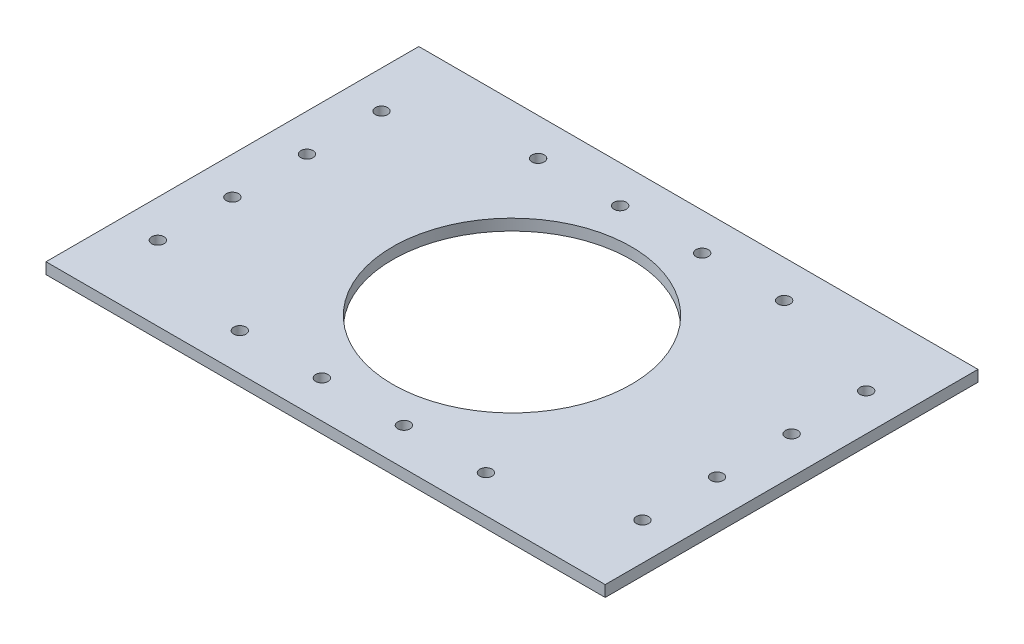
ISO-10303-21;
HEADER;
FILE_DESCRIPTION(('STEP AP214'),'2;1');
FILE_NAME('part.step','',(''),(''),'','','');
FILE_SCHEMA(('AUTOMOTIVE_DESIGN { 1 0 10303 214 1 1 1 1 }'));
ENDSEC;
DATA;
#1=APPLICATION_CONTEXT('core data for automotive mechanical design processes');
#2=APPLICATION_PROTOCOL_DEFINITION('international standard','automotive_design',2000,#1);
#3=PRODUCT_CONTEXT('',#1,'mechanical');
#4=PRODUCT('Part','Part','',(#3));
#5=PRODUCT_RELATED_PRODUCT_CATEGORY('part','',(#4));
#6=PRODUCT_DEFINITION_FORMATION('','',#4);
#7=PRODUCT_DEFINITION_CONTEXT('part definition',#1,'design');
#8=PRODUCT_DEFINITION('design','',#6,#7);
#9=PRODUCT_DEFINITION_SHAPE('','',#8);
#10=(LENGTH_UNIT() NAMED_UNIT(*) SI_UNIT(.MILLI.,.METRE.));
#11=(NAMED_UNIT(*) PLANE_ANGLE_UNIT() SI_UNIT($,.RADIAN.));
#12=(NAMED_UNIT(*) SI_UNIT($,.STERADIAN.) SOLID_ANGLE_UNIT());
#13=UNCERTAINTY_MEASURE_WITH_UNIT(LENGTH_MEASURE(1.E-05),#10,'distance_accuracy_value','');
#14=(GEOMETRIC_REPRESENTATION_CONTEXT(3) GLOBAL_UNCERTAINTY_ASSIGNED_CONTEXT((#13)) GLOBAL_UNIT_ASSIGNED_CONTEXT((#10,
#11,#12)) REPRESENTATION_CONTEXT('',''));
#15=CARTESIAN_POINT('',(0.,0.,0.));
#16=DIRECTION('',(0.,0.,1.));
#17=DIRECTION('',(1.,0.,0.));
#18=AXIS2_PLACEMENT_3D('',#15,#16,#17);
#19=CARTESIAN_POINT('',(0.,3.,0.));
#20=DIRECTION('',(0.,1.,0.));
#21=DIRECTION('',(0.,0.,1.));
#22=AXIS2_PLACEMENT_3D('',#19,#20,#21);
#23=PLANE('',#22);
#24=CARTESIAN_POINT('',(-11.,3.,40.));
#25=DIRECTION('',(0.,1.,0.));
#26=DIRECTION('',(0.,0.,-1.));
#27=AXIS2_PLACEMENT_3D('',#24,#25,#26);
#28=CIRCLE('',#27,1.65);
#29=CARTESIAN_POINT('',(-11.,3.,38.35));
#30=VERTEX_POINT('',#29);
#31=EDGE_CURVE('E207',#30,#30,#28,.T.);
#32=ORIENTED_EDGE('',*,*,#31,.F.);
#33=EDGE_LOOP('',(#32));
#34=FACE_BOUND('',#33,.T.);
#35=CARTESIAN_POINT('',(33.,3.,40.));
#36=DIRECTION('',(0.,1.,0.));
#37=DIRECTION('',(0.,0.,-1.));
#38=AXIS2_PLACEMENT_3D('',#35,#36,#37);
#39=CIRCLE('',#38,1.65);
#40=CARTESIAN_POINT('',(33.,3.,38.35));
#41=VERTEX_POINT('',#40);
#42=EDGE_CURVE('E195',#41,#41,#39,.T.);
#43=ORIENTED_EDGE('',*,*,#42,.F.);
#44=EDGE_LOOP('',(#43));
#45=FACE_BOUND('',#44,.T.);
#46=CARTESIAN_POINT('',(-11.,3.,-40.));
#47=DIRECTION('',(0.,1.,0.));
#48=DIRECTION('',(0.,0.,1.));
#49=AXIS2_PLACEMENT_3D('',#46,#47,#48);
#50=CIRCLE('',#49,1.65);
#51=CARTESIAN_POINT('',(-11.,3.,-38.35));
#52=VERTEX_POINT('',#51);
#53=EDGE_CURVE('E183',#52,#52,#50,.T.);
#54=ORIENTED_EDGE('',*,*,#53,.F.);
#55=EDGE_LOOP('',(#54));
#56=FACE_BOUND('',#55,.T.);
#57=CARTESIAN_POINT('',(33.,3.,-40.));
#58=DIRECTION('',(0.,1.,0.));
#59=DIRECTION('',(0.,0.,1.));
#60=AXIS2_PLACEMENT_3D('',#57,#58,#59);
#61=CIRCLE('',#60,1.65);
#62=CARTESIAN_POINT('',(33.,3.,-38.35));
#63=VERTEX_POINT('',#62);
#64=EDGE_CURVE('E171',#63,#63,#61,.T.);
#65=ORIENTED_EDGE('',*,*,#64,.F.);
#66=EDGE_LOOP('',(#65));
#67=FACE_BOUND('',#66,.T.);
#68=CARTESIAN_POINT('',(64.9999999999999,3.,-10.));
#69=DIRECTION('',(0.,1.,0.));
#70=DIRECTION('',(0.,0.,-1.));
#71=AXIS2_PLACEMENT_3D('',#68,#69,#70);
#72=CIRCLE('',#71,1.65);
#73=CARTESIAN_POINT('',(64.9999999999999,3.,-11.65));
#74=VERTEX_POINT('',#73);
#75=EDGE_CURVE('E159',#74,#74,#72,.T.);
#76=ORIENTED_EDGE('',*,*,#75,.F.);
#77=EDGE_LOOP('',(#76));
#78=FACE_BOUND('',#77,.T.);
#79=CARTESIAN_POINT('',(64.9999999999999,3.,30.));
#80=DIRECTION('',(0.,1.,0.));
#81=DIRECTION('',(0.,0.,-1.));
#82=AXIS2_PLACEMENT_3D('',#79,#80,#81);
#83=CIRCLE('',#82,1.65);
#84=CARTESIAN_POINT('',(64.9999999999999,3.,28.35));
#85=VERTEX_POINT('',#84);
#86=EDGE_CURVE('E147',#85,#85,#83,.T.);
#87=ORIENTED_EDGE('',*,*,#86,.F.);
#88=EDGE_LOOP('',(#87));
#89=FACE_BOUND('',#88,.T.);
#90=CARTESIAN_POINT('',(-65.,3.,9.99999999999999));
#91=DIRECTION('',(0.,1.,0.));
#92=DIRECTION('',(0.,0.,1.));
#93=AXIS2_PLACEMENT_3D('',#90,#91,#92);
#94=CIRCLE('',#93,1.65);
#95=CARTESIAN_POINT('',(-65.,3.,11.65));
#96=VERTEX_POINT('',#95);
#97=EDGE_CURVE('E135',#96,#96,#94,.T.);
#98=ORIENTED_EDGE('',*,*,#97,.F.);
#99=EDGE_LOOP('',(#98));
#100=FACE_BOUND('',#99,.T.);
#101=CARTESIAN_POINT('',(-65.,3.,-30.));
#102=DIRECTION('',(0.,1.,0.));
#103=DIRECTION('',(0.,0.,1.));
#104=AXIS2_PLACEMENT_3D('',#101,#102,#103);
#105=CIRCLE('',#104,1.65);
#106=CARTESIAN_POINT('',(-65.,3.,-28.35));
#107=VERTEX_POINT('',#106);
#108=EDGE_CURVE('E123',#107,#107,#105,.T.);
#109=ORIENTED_EDGE('',*,*,#108,.F.);
#110=EDGE_LOOP('',(#109));
#111=FACE_BOUND('',#110,.T.);
#112=DIRECTION('',(0.,0.,-1.));
#113=VECTOR('',#112,1.);
#114=CARTESIAN_POINT('',(75.,3.,-50.));
#115=LINE('',#114,#113);
#116=CARTESIAN_POINT('',(75.,3.,50.));
#117=VERTEX_POINT('',#116);
#118=CARTESIAN_POINT('',(75.,3.,-50.));
#119=VERTEX_POINT('',#118);
#120=EDGE_CURVE('E93',#117,#119,#115,.T.);
#121=ORIENTED_EDGE('',*,*,#120,.T.);
#122=DIRECTION('',(-1.,0.,0.));
#123=VECTOR('',#122,1.);
#124=CARTESIAN_POINT('',(-75.,3.,-50.));
#125=LINE('',#124,#123);
#126=CARTESIAN_POINT('',(-75.,3.,-50.));
#127=VERTEX_POINT('',#126);
#128=EDGE_CURVE('E88',#119,#127,#125,.T.);
#129=ORIENTED_EDGE('',*,*,#128,.T.);
#130=DIRECTION('',(0.,0.,1.));
#131=VECTOR('',#130,1.);
#132=CARTESIAN_POINT('',(-75.,3.,-50.));
#133=LINE('',#132,#131);
#134=CARTESIAN_POINT('',(-75.,3.,50.));
#135=VERTEX_POINT('',#134);
#136=EDGE_CURVE('E91',#127,#135,#133,.T.);
#137=ORIENTED_EDGE('',*,*,#136,.T.);
#138=DIRECTION('',(1.,0.,0.));
#139=VECTOR('',#138,1.);
#140=CARTESIAN_POINT('',(-75.,3.,50.));
#141=LINE('',#140,#139);
#142=EDGE_CURVE('E58',#135,#117,#141,.T.);
#143=ORIENTED_EDGE('',*,*,#142,.T.);
#144=EDGE_LOOP('',(#121,#129,#137,#143));
#145=FACE_BOUND('',#144,.T.);
#146=CARTESIAN_POINT('',(0.,3.,0.));
#147=DIRECTION('',(0.,1.,0.));
#148=DIRECTION('',(0.,0.,1.));
#149=AXIS2_PLACEMENT_3D('',#146,#147,#148);
#150=CIRCLE('',#149,32.);
#151=CARTESIAN_POINT('',(0.,3.,32.));
#152=VERTEX_POINT('',#151);
#153=EDGE_CURVE('E108',#152,#152,#150,.T.);
#154=ORIENTED_EDGE('',*,*,#153,.F.);
#155=EDGE_LOOP('',(#154));
#156=FACE_BOUND('',#155,.T.);
#157=CARTESIAN_POINT('',(-65.,3.,-10.));
#158=DIRECTION('',(0.,1.,0.));
#159=DIRECTION('',(0.,0.,1.));
#160=AXIS2_PLACEMENT_3D('',#157,#158,#159);
#161=CIRCLE('',#160,1.65);
#162=CARTESIAN_POINT('',(-65.,3.,-8.35000000000001));
#163=VERTEX_POINT('',#162);
#164=EDGE_CURVE('E129',#163,#163,#161,.T.);
#165=ORIENTED_EDGE('',*,*,#164,.F.);
#166=EDGE_LOOP('',(#165));
#167=FACE_BOUND('',#166,.T.);
#168=CARTESIAN_POINT('',(-65.,3.,30.));
#169=DIRECTION('',(0.,1.,0.));
#170=DIRECTION('',(0.,0.,1.));
#171=AXIS2_PLACEMENT_3D('',#168,#169,#170);
#172=CIRCLE('',#171,1.65);
#173=CARTESIAN_POINT('',(-65.,3.,31.65));
#174=VERTEX_POINT('',#173);
#175=EDGE_CURVE('E141',#174,#174,#172,.T.);
#176=ORIENTED_EDGE('',*,*,#175,.F.);
#177=EDGE_LOOP('',(#176));
#178=FACE_BOUND('',#177,.T.);
#179=CARTESIAN_POINT('',(64.9999999999999,3.,9.99999999999998));
#180=DIRECTION('',(0.,1.,0.));
#181=DIRECTION('',(0.,0.,-1.));
#182=AXIS2_PLACEMENT_3D('',#179,#180,#181);
#183=CIRCLE('',#182,1.65);
#184=CARTESIAN_POINT('',(64.9999999999999,3.,8.34999999999998));
#185=VERTEX_POINT('',#184);
#186=EDGE_CURVE('E153',#185,#185,#183,.T.);
#187=ORIENTED_EDGE('',*,*,#186,.F.);
#188=EDGE_LOOP('',(#187));
#189=FACE_BOUND('',#188,.T.);
#190=CARTESIAN_POINT('',(64.9999999999999,3.,-30.));
#191=DIRECTION('',(0.,1.,0.));
#192=DIRECTION('',(0.,0.,-1.));
#193=AXIS2_PLACEMENT_3D('',#190,#191,#192);
#194=CIRCLE('',#193,1.65);
#195=CARTESIAN_POINT('',(64.9999999999999,3.,-31.65));
#196=VERTEX_POINT('',#195);
#197=EDGE_CURVE('E165',#196,#196,#194,.T.);
#198=ORIENTED_EDGE('',*,*,#197,.F.);
#199=EDGE_LOOP('',(#198));
#200=FACE_BOUND('',#199,.T.);
#201=CARTESIAN_POINT('',(11.,3.,-40.));
#202=DIRECTION('',(0.,1.,0.));
#203=DIRECTION('',(0.,0.,1.));
#204=AXIS2_PLACEMENT_3D('',#201,#202,#203);
#205=CIRCLE('',#204,1.65);
#206=CARTESIAN_POINT('',(11.,3.,-38.35));
#207=VERTEX_POINT('',#206);
#208=EDGE_CURVE('E177',#207,#207,#205,.T.);
#209=ORIENTED_EDGE('',*,*,#208,.F.);
#210=EDGE_LOOP('',(#209));
#211=FACE_BOUND('',#210,.T.);
#212=CARTESIAN_POINT('',(-33.,3.,-40.));
#213=DIRECTION('',(0.,1.,0.));
#214=DIRECTION('',(0.,0.,1.));
#215=AXIS2_PLACEMENT_3D('',#212,#213,#214);
#216=CIRCLE('',#215,1.65);
#217=CARTESIAN_POINT('',(-33.,3.,-38.35));
#218=VERTEX_POINT('',#217);
#219=EDGE_CURVE('E189',#218,#218,#216,.T.);
#220=ORIENTED_EDGE('',*,*,#219,.F.);
#221=EDGE_LOOP('',(#220));
#222=FACE_BOUND('',#221,.T.);
#223=CARTESIAN_POINT('',(11.,3.,40.));
#224=DIRECTION('',(0.,1.,0.));
#225=DIRECTION('',(0.,0.,-1.));
#226=AXIS2_PLACEMENT_3D('',#223,#224,#225);
#227=CIRCLE('',#226,1.65);
#228=CARTESIAN_POINT('',(11.,3.,38.35));
#229=VERTEX_POINT('',#228);
#230=EDGE_CURVE('E201',#229,#229,#227,.T.);
#231=ORIENTED_EDGE('',*,*,#230,.F.);
#232=EDGE_LOOP('',(#231));
#233=FACE_BOUND('',#232,.T.);
#234=CARTESIAN_POINT('',(-33.,3.,40.));
#235=DIRECTION('',(0.,1.,0.));
#236=DIRECTION('',(0.,0.,-1.));
#237=AXIS2_PLACEMENT_3D('',#234,#235,#236);
#238=CIRCLE('',#237,1.65);
#239=CARTESIAN_POINT('',(-33.,3.,38.35));
#240=VERTEX_POINT('',#239);
#241=EDGE_CURVE('E213',#240,#240,#238,.T.);
#242=ORIENTED_EDGE('',*,*,#241,.F.);
#243=EDGE_LOOP('',(#242));
#244=FACE_BOUND('',#243,.T.);
#245=ADVANCED_FACE('F41',(#34,#45,#56,#67,#78,#89,#100,#111,#145,#156,#167,#178,#189,#200,#211,
#222,#233,#244),#23,.T.);
#246=CARTESIAN_POINT('',(0.,0.,0.));
#247=DIRECTION('',(0.,1.,0.));
#248=DIRECTION('',(0.,0.,1.));
#249=AXIS2_PLACEMENT_3D('',#246,#247,#248);
#250=PLANE('',#249);
#251=DIRECTION('',(0.,0.,-1.));
#252=VECTOR('',#251,1.);
#253=CARTESIAN_POINT('',(75.,0.,-50.));
#254=LINE('',#253,#252);
#255=CARTESIAN_POINT('',(75.,0.,50.));
#256=VERTEX_POINT('',#255);
#257=CARTESIAN_POINT('',(75.,0.,-50.));
#258=VERTEX_POINT('',#257);
#259=EDGE_CURVE('E105',#256,#258,#254,.T.);
#260=ORIENTED_EDGE('',*,*,#259,.F.);
#261=DIRECTION('',(1.,0.,0.));
#262=VECTOR('',#261,1.);
#263=CARTESIAN_POINT('',(-75.,0.,50.));
#264=LINE('',#263,#262);
#265=CARTESIAN_POINT('',(-75.,0.,50.));
#266=VERTEX_POINT('',#265);
#267=EDGE_CURVE('E81',#266,#256,#264,.T.);
#268=ORIENTED_EDGE('',*,*,#267,.F.);
#269=DIRECTION('',(0.,0.,1.));
#270=VECTOR('',#269,1.);
#271=CARTESIAN_POINT('',(-75.,0.,-50.));
#272=LINE('',#271,#270);
#273=CARTESIAN_POINT('',(-75.,0.,-50.));
#274=VERTEX_POINT('',#273);
#275=EDGE_CURVE('E75',#274,#266,#272,.T.);
#276=ORIENTED_EDGE('',*,*,#275,.F.);
#277=DIRECTION('',(-1.,0.,0.));
#278=VECTOR('',#277,1.);
#279=CARTESIAN_POINT('',(-75.,0.,-50.));
#280=LINE('',#279,#278);
#281=EDGE_CURVE('E97',#258,#274,#280,.T.);
#282=ORIENTED_EDGE('',*,*,#281,.F.);
#283=EDGE_LOOP('',(#260,#268,#276,#282));
#284=FACE_BOUND('',#283,.T.);
#285=CARTESIAN_POINT('',(0.,0.,0.));
#286=DIRECTION('',(0.,1.,0.));
#287=DIRECTION('',(0.,0.,1.));
#288=AXIS2_PLACEMENT_3D('',#285,#286,#287);
#289=CIRCLE('',#288,32.);
#290=CARTESIAN_POINT('',(0.,0.,32.));
#291=VERTEX_POINT('',#290);
#292=EDGE_CURVE('E120',#291,#291,#289,.T.);
#293=ORIENTED_EDGE('',*,*,#292,.T.);
#294=EDGE_LOOP('',(#293));
#295=FACE_BOUND('',#294,.T.);
#296=CARTESIAN_POINT('',(-65.,0.,-30.));
#297=DIRECTION('',(0.,1.,0.));
#298=DIRECTION('',(0.,0.,1.));
#299=AXIS2_PLACEMENT_3D('',#296,#297,#298);
#300=CIRCLE('',#299,1.65);
#301=CARTESIAN_POINT('',(-65.,0.,-28.35));
#302=VERTEX_POINT('',#301);
#303=EDGE_CURVE('E126',#302,#302,#300,.T.);
#304=ORIENTED_EDGE('',*,*,#303,.T.);
#305=EDGE_LOOP('',(#304));
#306=FACE_BOUND('',#305,.T.);
#307=CARTESIAN_POINT('',(-65.,0.,-10.));
#308=DIRECTION('',(0.,1.,0.));
#309=DIRECTION('',(0.,0.,1.));
#310=AXIS2_PLACEMENT_3D('',#307,#308,#309);
#311=CIRCLE('',#310,1.65);
#312=CARTESIAN_POINT('',(-65.,0.,-8.35000000000001));
#313=VERTEX_POINT('',#312);
#314=EDGE_CURVE('E132',#313,#313,#311,.T.);
#315=ORIENTED_EDGE('',*,*,#314,.T.);
#316=EDGE_LOOP('',(#315));
#317=FACE_BOUND('',#316,.T.);
#318=CARTESIAN_POINT('',(-65.,0.,9.99999999999999));
#319=DIRECTION('',(0.,1.,0.));
#320=DIRECTION('',(0.,0.,1.));
#321=AXIS2_PLACEMENT_3D('',#318,#319,#320);
#322=CIRCLE('',#321,1.65);
#323=CARTESIAN_POINT('',(-65.,0.,11.65));
#324=VERTEX_POINT('',#323);
#325=EDGE_CURVE('E138',#324,#324,#322,.T.);
#326=ORIENTED_EDGE('',*,*,#325,.T.);
#327=EDGE_LOOP('',(#326));
#328=FACE_BOUND('',#327,.T.);
#329=CARTESIAN_POINT('',(-65.,0.,30.));
#330=DIRECTION('',(0.,1.,0.));
#331=DIRECTION('',(0.,0.,1.));
#332=AXIS2_PLACEMENT_3D('',#329,#330,#331);
#333=CIRCLE('',#332,1.65);
#334=CARTESIAN_POINT('',(-65.,0.,31.65));
#335=VERTEX_POINT('',#334);
#336=EDGE_CURVE('E144',#335,#335,#333,.T.);
#337=ORIENTED_EDGE('',*,*,#336,.T.);
#338=EDGE_LOOP('',(#337));
#339=FACE_BOUND('',#338,.T.);
#340=CARTESIAN_POINT('',(64.9999999999999,0.,30.));
#341=DIRECTION('',(0.,1.,0.));
#342=DIRECTION('',(0.,0.,-1.));
#343=AXIS2_PLACEMENT_3D('',#340,#341,#342);
#344=CIRCLE('',#343,1.65);
#345=CARTESIAN_POINT('',(64.9999999999999,0.,28.35));
#346=VERTEX_POINT('',#345);
#347=EDGE_CURVE('E150',#346,#346,#344,.T.);
#348=ORIENTED_EDGE('',*,*,#347,.T.);
#349=EDGE_LOOP('',(#348));
#350=FACE_BOUND('',#349,.T.);
#351=CARTESIAN_POINT('',(64.9999999999999,0.,9.99999999999998));
#352=DIRECTION('',(0.,1.,0.));
#353=DIRECTION('',(0.,0.,-1.));
#354=AXIS2_PLACEMENT_3D('',#351,#352,#353);
#355=CIRCLE('',#354,1.65);
#356=CARTESIAN_POINT('',(64.9999999999999,0.,8.34999999999998));
#357=VERTEX_POINT('',#356);
#358=EDGE_CURVE('E156',#357,#357,#355,.T.);
#359=ORIENTED_EDGE('',*,*,#358,.T.);
#360=EDGE_LOOP('',(#359));
#361=FACE_BOUND('',#360,.T.);
#362=CARTESIAN_POINT('',(64.9999999999999,0.,-10.));
#363=DIRECTION('',(0.,1.,0.));
#364=DIRECTION('',(0.,0.,-1.));
#365=AXIS2_PLACEMENT_3D('',#362,#363,#364);
#366=CIRCLE('',#365,1.65);
#367=CARTESIAN_POINT('',(64.9999999999999,0.,-11.65));
#368=VERTEX_POINT('',#367);
#369=EDGE_CURVE('E162',#368,#368,#366,.T.);
#370=ORIENTED_EDGE('',*,*,#369,.T.);
#371=EDGE_LOOP('',(#370));
#372=FACE_BOUND('',#371,.T.);
#373=CARTESIAN_POINT('',(64.9999999999999,0.,-30.));
#374=DIRECTION('',(0.,1.,0.));
#375=DIRECTION('',(0.,0.,-1.));
#376=AXIS2_PLACEMENT_3D('',#373,#374,#375);
#377=CIRCLE('',#376,1.65);
#378=CARTESIAN_POINT('',(64.9999999999999,0.,-31.65));
#379=VERTEX_POINT('',#378);
#380=EDGE_CURVE('E168',#379,#379,#377,.T.);
#381=ORIENTED_EDGE('',*,*,#380,.T.);
#382=EDGE_LOOP('',(#381));
#383=FACE_BOUND('',#382,.T.);
#384=CARTESIAN_POINT('',(33.,0.,-40.));
#385=DIRECTION('',(0.,1.,0.));
#386=DIRECTION('',(0.,0.,1.));
#387=AXIS2_PLACEMENT_3D('',#384,#385,#386);
#388=CIRCLE('',#387,1.65);
#389=CARTESIAN_POINT('',(33.,0.,-38.35));
#390=VERTEX_POINT('',#389);
#391=EDGE_CURVE('E174',#390,#390,#388,.T.);
#392=ORIENTED_EDGE('',*,*,#391,.T.);
#393=EDGE_LOOP('',(#392));
#394=FACE_BOUND('',#393,.T.);
#395=CARTESIAN_POINT('',(11.,0.,-40.));
#396=DIRECTION('',(0.,1.,0.));
#397=DIRECTION('',(0.,0.,1.));
#398=AXIS2_PLACEMENT_3D('',#395,#396,#397);
#399=CIRCLE('',#398,1.65);
#400=CARTESIAN_POINT('',(11.,0.,-38.35));
#401=VERTEX_POINT('',#400);
#402=EDGE_CURVE('E180',#401,#401,#399,.T.);
#403=ORIENTED_EDGE('',*,*,#402,.T.);
#404=EDGE_LOOP('',(#403));
#405=FACE_BOUND('',#404,.T.);
#406=CARTESIAN_POINT('',(-11.,0.,-40.));
#407=DIRECTION('',(0.,1.,0.));
#408=DIRECTION('',(0.,0.,1.));
#409=AXIS2_PLACEMENT_3D('',#406,#407,#408);
#410=CIRCLE('',#409,1.65);
#411=CARTESIAN_POINT('',(-11.,0.,-38.35));
#412=VERTEX_POINT('',#411);
#413=EDGE_CURVE('E186',#412,#412,#410,.T.);
#414=ORIENTED_EDGE('',*,*,#413,.T.);
#415=EDGE_LOOP('',(#414));
#416=FACE_BOUND('',#415,.T.);
#417=CARTESIAN_POINT('',(-33.,0.,-40.));
#418=DIRECTION('',(0.,1.,0.));
#419=DIRECTION('',(0.,0.,1.));
#420=AXIS2_PLACEMENT_3D('',#417,#418,#419);
#421=CIRCLE('',#420,1.65);
#422=CARTESIAN_POINT('',(-33.,0.,-38.35));
#423=VERTEX_POINT('',#422);
#424=EDGE_CURVE('E192',#423,#423,#421,.T.);
#425=ORIENTED_EDGE('',*,*,#424,.T.);
#426=EDGE_LOOP('',(#425));
#427=FACE_BOUND('',#426,.T.);
#428=CARTESIAN_POINT('',(33.,0.,40.));
#429=DIRECTION('',(0.,1.,0.));
#430=DIRECTION('',(0.,0.,-1.));
#431=AXIS2_PLACEMENT_3D('',#428,#429,#430);
#432=CIRCLE('',#431,1.65);
#433=CARTESIAN_POINT('',(33.,0.,38.35));
#434=VERTEX_POINT('',#433);
#435=EDGE_CURVE('E198',#434,#434,#432,.T.);
#436=ORIENTED_EDGE('',*,*,#435,.T.);
#437=EDGE_LOOP('',(#436));
#438=FACE_BOUND('',#437,.T.);
#439=CARTESIAN_POINT('',(11.,0.,40.));
#440=DIRECTION('',(0.,1.,0.));
#441=DIRECTION('',(0.,0.,-1.));
#442=AXIS2_PLACEMENT_3D('',#439,#440,#441);
#443=CIRCLE('',#442,1.65);
#444=CARTESIAN_POINT('',(11.,0.,38.35));
#445=VERTEX_POINT('',#444);
#446=EDGE_CURVE('E204',#445,#445,#443,.T.);
#447=ORIENTED_EDGE('',*,*,#446,.T.);
#448=EDGE_LOOP('',(#447));
#449=FACE_BOUND('',#448,.T.);
#450=CARTESIAN_POINT('',(-11.,0.,40.));
#451=DIRECTION('',(0.,1.,0.));
#452=DIRECTION('',(0.,0.,-1.));
#453=AXIS2_PLACEMENT_3D('',#450,#451,#452);
#454=CIRCLE('',#453,1.65);
#455=CARTESIAN_POINT('',(-11.,0.,38.35));
#456=VERTEX_POINT('',#455);
#457=EDGE_CURVE('E210',#456,#456,#454,.T.);
#458=ORIENTED_EDGE('',*,*,#457,.T.);
#459=EDGE_LOOP('',(#458));
#460=FACE_BOUND('',#459,.T.);
#461=CARTESIAN_POINT('',(-33.,0.,40.));
#462=DIRECTION('',(0.,1.,0.));
#463=DIRECTION('',(0.,0.,-1.));
#464=AXIS2_PLACEMENT_3D('',#461,#462,#463);
#465=CIRCLE('',#464,1.65);
#466=CARTESIAN_POINT('',(-33.,0.,38.35));
#467=VERTEX_POINT('',#466);
#468=EDGE_CURVE('E216',#467,#467,#465,.T.);
#469=ORIENTED_EDGE('',*,*,#468,.T.);
#470=EDGE_LOOP('',(#469));
#471=FACE_BOUND('',#470,.T.);
#472=ADVANCED_FACE('F116',(#284,#295,#306,#317,#328,#339,#350,#361,#372,#383,#394,#405,#416,
#427,#438,#449,#460,#471),#250,.F.);
#473=CARTESIAN_POINT('',(75.,3.,-50.));
#474=DIRECTION('',(-1.,0.,0.));
#475=DIRECTION('',(0.,0.,1.));
#476=AXIS2_PLACEMENT_3D('',#473,#474,#475);
#477=PLANE('',#476);
#478=ORIENTED_EDGE('',*,*,#259,.T.);
#479=DIRECTION('',(0.,-1.,0.));
#480=VECTOR('',#479,1.);
#481=CARTESIAN_POINT('',(75.,3.,-50.));
#482=LINE('',#481,#480);
#483=EDGE_CURVE('E11',#119,#258,#482,.T.);
#484=ORIENTED_EDGE('',*,*,#483,.F.);
#485=ORIENTED_EDGE('',*,*,#120,.F.);
#486=DIRECTION('',(0.,-1.,0.));
#487=VECTOR('',#486,1.);
#488=CARTESIAN_POINT('',(75.,3.,50.));
#489=LINE('',#488,#487);
#490=EDGE_CURVE('E101',#117,#256,#489,.T.);
#491=ORIENTED_EDGE('',*,*,#490,.T.);
#492=EDGE_LOOP('',(#478,#484,#485,#491));
#493=FACE_BOUND('',#492,.T.);
#494=ADVANCED_FACE('F43',(#493),#477,.F.);
#495=CARTESIAN_POINT('',(-75.,3.,-50.));
#496=DIRECTION('',(0.,0.,1.));
#497=DIRECTION('',(1.,0.,0.));
#498=AXIS2_PLACEMENT_3D('',#495,#496,#497);
#499=PLANE('',#498);
#500=ORIENTED_EDGE('',*,*,#281,.T.);
#501=DIRECTION('',(0.,-1.,0.));
#502=VECTOR('',#501,1.);
#503=CARTESIAN_POINT('',(-75.,3.,-50.));
#504=LINE('',#503,#502);
#505=EDGE_CURVE('E50',#127,#274,#504,.T.);
#506=ORIENTED_EDGE('',*,*,#505,.F.);
#507=ORIENTED_EDGE('',*,*,#128,.F.);
#508=ORIENTED_EDGE('',*,*,#483,.T.);
#509=EDGE_LOOP('',(#500,#506,#507,#508));
#510=FACE_BOUND('',#509,.T.);
#511=ADVANCED_FACE('F96',(#510),#499,.F.);
#512=CARTESIAN_POINT('',(-75.,3.,-50.));
#513=DIRECTION('',(1.,0.,0.));
#514=DIRECTION('',(0.,0.,-1.));
#515=AXIS2_PLACEMENT_3D('',#512,#513,#514);
#516=PLANE('',#515);
#517=ORIENTED_EDGE('',*,*,#275,.T.);
#518=DIRECTION('',(0.,-1.,0.));
#519=VECTOR('',#518,1.);
#520=CARTESIAN_POINT('',(-75.,3.,50.));
#521=LINE('',#520,#519);
#522=EDGE_CURVE('E98',#135,#266,#521,.T.);
#523=ORIENTED_EDGE('',*,*,#522,.F.);
#524=ORIENTED_EDGE('',*,*,#136,.F.);
#525=ORIENTED_EDGE('',*,*,#505,.T.);
#526=EDGE_LOOP('',(#517,#523,#524,#525));
#527=FACE_BOUND('',#526,.T.);
#528=ADVANCED_FACE('F99',(#527),#516,.F.);
#529=CARTESIAN_POINT('',(-75.,3.,50.));
#530=DIRECTION('',(0.,0.,-1.));
#531=DIRECTION('',(-1.,0.,0.));
#532=AXIS2_PLACEMENT_3D('',#529,#530,#531);
#533=PLANE('',#532);
#534=ORIENTED_EDGE('',*,*,#267,.T.);
#535=ORIENTED_EDGE('',*,*,#490,.F.);
#536=ORIENTED_EDGE('',*,*,#142,.F.);
#537=ORIENTED_EDGE('',*,*,#522,.T.);
#538=EDGE_LOOP('',(#534,#535,#536,#537));
#539=FACE_BOUND('',#538,.T.);
#540=ADVANCED_FACE('F113',(#539),#533,.F.);
#541=CARTESIAN_POINT('',(0.,3.,0.));
#542=DIRECTION('',(0.,-1.,0.));
#543=DIRECTION('',(0.,0.,-1.));
#544=AXIS2_PLACEMENT_3D('',#541,#542,#543);
#545=CYLINDRICAL_SURFACE('',#544,32.);
#546=ORIENTED_EDGE('',*,*,#153,.T.);
#547=EDGE_LOOP('',(#546));
#548=FACE_BOUND('',#547,.T.);
#549=ORIENTED_EDGE('',*,*,#292,.F.);
#550=EDGE_LOOP('',(#549));
#551=FACE_BOUND('',#550,.T.);
#552=ADVANCED_FACE('F235',(#548,#551),#545,.F.);
#553=CARTESIAN_POINT('',(-65.,3.,-30.));
#554=DIRECTION('',(0.,-1.,0.));
#555=DIRECTION('',(0.,0.,-1.));
#556=AXIS2_PLACEMENT_3D('',#553,#554,#555);
#557=CYLINDRICAL_SURFACE('',#556,1.65);
#558=ORIENTED_EDGE('',*,*,#108,.T.);
#559=EDGE_LOOP('',(#558));
#560=FACE_BOUND('',#559,.T.);
#561=ORIENTED_EDGE('',*,*,#303,.F.);
#562=EDGE_LOOP('',(#561));
#563=FACE_BOUND('',#562,.T.);
#564=ADVANCED_FACE('F280',(#560,#563),#557,.F.);
#565=CARTESIAN_POINT('',(-65.,3.,-10.));
#566=DIRECTION('',(0.,-1.,0.));
#567=DIRECTION('',(0.,0.,-1.));
#568=AXIS2_PLACEMENT_3D('',#565,#566,#567);
#569=CYLINDRICAL_SURFACE('',#568,1.65);
#570=ORIENTED_EDGE('',*,*,#164,.T.);
#571=EDGE_LOOP('',(#570));
#572=FACE_BOUND('',#571,.T.);
#573=ORIENTED_EDGE('',*,*,#314,.F.);
#574=EDGE_LOOP('',(#573));
#575=FACE_BOUND('',#574,.T.);
#576=ADVANCED_FACE('F288',(#572,#575),#569,.F.);
#577=CARTESIAN_POINT('',(-65.,3.,9.99999999999999));
#578=DIRECTION('',(0.,-1.,0.));
#579=DIRECTION('',(0.,0.,-1.));
#580=AXIS2_PLACEMENT_3D('',#577,#578,#579);
#581=CYLINDRICAL_SURFACE('',#580,1.65);
#582=ORIENTED_EDGE('',*,*,#97,.T.);
#583=EDGE_LOOP('',(#582));
#584=FACE_BOUND('',#583,.T.);
#585=ORIENTED_EDGE('',*,*,#325,.F.);
#586=EDGE_LOOP('',(#585));
#587=FACE_BOUND('',#586,.T.);
#588=ADVANCED_FACE('F296',(#584,#587),#581,.F.);
#589=CARTESIAN_POINT('',(-65.,3.,30.));
#590=DIRECTION('',(0.,-1.,0.));
#591=DIRECTION('',(0.,0.,-1.));
#592=AXIS2_PLACEMENT_3D('',#589,#590,#591);
#593=CYLINDRICAL_SURFACE('',#592,1.65);
#594=ORIENTED_EDGE('',*,*,#175,.T.);
#595=EDGE_LOOP('',(#594));
#596=FACE_BOUND('',#595,.T.);
#597=ORIENTED_EDGE('',*,*,#336,.F.);
#598=EDGE_LOOP('',(#597));
#599=FACE_BOUND('',#598,.T.);
#600=ADVANCED_FACE('F305',(#596,#599),#593,.F.);
#601=CARTESIAN_POINT('',(64.9999999999999,3.,30.));
#602=DIRECTION('',(0.,-1.,0.));
#603=DIRECTION('',(0.,0.,-1.));
#604=AXIS2_PLACEMENT_3D('',#601,#602,#603);
#605=CYLINDRICAL_SURFACE('',#604,1.65);
#606=ORIENTED_EDGE('',*,*,#86,.T.);
#607=EDGE_LOOP('',(#606));
#608=FACE_BOUND('',#607,.T.);
#609=ORIENTED_EDGE('',*,*,#347,.F.);
#610=EDGE_LOOP('',(#609));
#611=FACE_BOUND('',#610,.T.);
#612=ADVANCED_FACE('F314',(#608,#611),#605,.F.);
#613=CARTESIAN_POINT('',(64.9999999999999,3.,9.99999999999998));
#614=DIRECTION('',(0.,-1.,0.));
#615=DIRECTION('',(0.,0.,-1.));
#616=AXIS2_PLACEMENT_3D('',#613,#614,#615);
#617=CYLINDRICAL_SURFACE('',#616,1.65);
#618=ORIENTED_EDGE('',*,*,#186,.T.);
#619=EDGE_LOOP('',(#618));
#620=FACE_BOUND('',#619,.T.);
#621=ORIENTED_EDGE('',*,*,#358,.F.);
#622=EDGE_LOOP('',(#621));
#623=FACE_BOUND('',#622,.T.);
#624=ADVANCED_FACE('F323',(#620,#623),#617,.F.);
#625=CARTESIAN_POINT('',(64.9999999999999,3.,-10.));
#626=DIRECTION('',(0.,-1.,0.));
#627=DIRECTION('',(0.,0.,-1.));
#628=AXIS2_PLACEMENT_3D('',#625,#626,#627);
#629=CYLINDRICAL_SURFACE('',#628,1.65);
#630=ORIENTED_EDGE('',*,*,#75,.T.);
#631=EDGE_LOOP('',(#630));
#632=FACE_BOUND('',#631,.T.);
#633=ORIENTED_EDGE('',*,*,#369,.F.);
#634=EDGE_LOOP('',(#633));
#635=FACE_BOUND('',#634,.T.);
#636=ADVANCED_FACE('F332',(#632,#635),#629,.F.);
#637=CARTESIAN_POINT('',(64.9999999999999,3.,-30.));
#638=DIRECTION('',(0.,-1.,0.));
#639=DIRECTION('',(0.,0.,-1.));
#640=AXIS2_PLACEMENT_3D('',#637,#638,#639);
#641=CYLINDRICAL_SURFACE('',#640,1.65);
#642=ORIENTED_EDGE('',*,*,#197,.T.);
#643=EDGE_LOOP('',(#642));
#644=FACE_BOUND('',#643,.T.);
#645=ORIENTED_EDGE('',*,*,#380,.F.);
#646=EDGE_LOOP('',(#645));
#647=FACE_BOUND('',#646,.T.);
#648=ADVANCED_FACE('F341',(#644,#647),#641,.F.);
#649=CARTESIAN_POINT('',(33.,3.,-40.));
#650=DIRECTION('',(0.,-1.,0.));
#651=DIRECTION('',(0.,0.,-1.));
#652=AXIS2_PLACEMENT_3D('',#649,#650,#651);
#653=CYLINDRICAL_SURFACE('',#652,1.65);
#654=ORIENTED_EDGE('',*,*,#64,.T.);
#655=EDGE_LOOP('',(#654));
#656=FACE_BOUND('',#655,.T.);
#657=ORIENTED_EDGE('',*,*,#391,.F.);
#658=EDGE_LOOP('',(#657));
#659=FACE_BOUND('',#658,.T.);
#660=ADVANCED_FACE('F350',(#656,#659),#653,.F.);
#661=CARTESIAN_POINT('',(11.,3.,-40.));
#662=DIRECTION('',(0.,-1.,0.));
#663=DIRECTION('',(0.,0.,-1.));
#664=AXIS2_PLACEMENT_3D('',#661,#662,#663);
#665=CYLINDRICAL_SURFACE('',#664,1.65);
#666=ORIENTED_EDGE('',*,*,#208,.T.);
#667=EDGE_LOOP('',(#666));
#668=FACE_BOUND('',#667,.T.);
#669=ORIENTED_EDGE('',*,*,#402,.F.);
#670=EDGE_LOOP('',(#669));
#671=FACE_BOUND('',#670,.T.);
#672=ADVANCED_FACE('F359',(#668,#671),#665,.F.);
#673=CARTESIAN_POINT('',(-11.,3.,-40.));
#674=DIRECTION('',(0.,-1.,0.));
#675=DIRECTION('',(0.,0.,-1.));
#676=AXIS2_PLACEMENT_3D('',#673,#674,#675);
#677=CYLINDRICAL_SURFACE('',#676,1.65);
#678=ORIENTED_EDGE('',*,*,#53,.T.);
#679=EDGE_LOOP('',(#678));
#680=FACE_BOUND('',#679,.T.);
#681=ORIENTED_EDGE('',*,*,#413,.F.);
#682=EDGE_LOOP('',(#681));
#683=FACE_BOUND('',#682,.T.);
#684=ADVANCED_FACE('F368',(#680,#683),#677,.F.);
#685=CARTESIAN_POINT('',(-33.,3.,-40.));
#686=DIRECTION('',(0.,-1.,0.));
#687=DIRECTION('',(0.,0.,-1.));
#688=AXIS2_PLACEMENT_3D('',#685,#686,#687);
#689=CYLINDRICAL_SURFACE('',#688,1.65);
#690=ORIENTED_EDGE('',*,*,#219,.T.);
#691=EDGE_LOOP('',(#690));
#692=FACE_BOUND('',#691,.T.);
#693=ORIENTED_EDGE('',*,*,#424,.F.);
#694=EDGE_LOOP('',(#693));
#695=FACE_BOUND('',#694,.T.);
#696=ADVANCED_FACE('F377',(#692,#695),#689,.F.);
#697=CARTESIAN_POINT('',(33.,3.,40.));
#698=DIRECTION('',(0.,-1.,0.));
#699=DIRECTION('',(0.,0.,-1.));
#700=AXIS2_PLACEMENT_3D('',#697,#698,#699);
#701=CYLINDRICAL_SURFACE('',#700,1.65);
#702=ORIENTED_EDGE('',*,*,#42,.T.);
#703=EDGE_LOOP('',(#702));
#704=FACE_BOUND('',#703,.T.);
#705=ORIENTED_EDGE('',*,*,#435,.F.);
#706=EDGE_LOOP('',(#705));
#707=FACE_BOUND('',#706,.T.);
#708=ADVANCED_FACE('F386',(#704,#707),#701,.F.);
#709=CARTESIAN_POINT('',(11.,3.,40.));
#710=DIRECTION('',(0.,-1.,0.));
#711=DIRECTION('',(0.,0.,-1.));
#712=AXIS2_PLACEMENT_3D('',#709,#710,#711);
#713=CYLINDRICAL_SURFACE('',#712,1.65);
#714=ORIENTED_EDGE('',*,*,#230,.T.);
#715=EDGE_LOOP('',(#714));
#716=FACE_BOUND('',#715,.T.);
#717=ORIENTED_EDGE('',*,*,#446,.F.);
#718=EDGE_LOOP('',(#717));
#719=FACE_BOUND('',#718,.T.);
#720=ADVANCED_FACE('F395',(#716,#719),#713,.F.);
#721=CARTESIAN_POINT('',(-11.,3.,40.));
#722=DIRECTION('',(0.,-1.,0.));
#723=DIRECTION('',(0.,0.,-1.));
#724=AXIS2_PLACEMENT_3D('',#721,#722,#723);
#725=CYLINDRICAL_SURFACE('',#724,1.65);
#726=ORIENTED_EDGE('',*,*,#31,.T.);
#727=EDGE_LOOP('',(#726));
#728=FACE_BOUND('',#727,.T.);
#729=ORIENTED_EDGE('',*,*,#457,.F.);
#730=EDGE_LOOP('',(#729));
#731=FACE_BOUND('',#730,.T.);
#732=ADVANCED_FACE('F404',(#728,#731),#725,.F.);
#733=CARTESIAN_POINT('',(-33.,3.,40.));
#734=DIRECTION('',(0.,-1.,0.));
#735=DIRECTION('',(0.,0.,-1.));
#736=AXIS2_PLACEMENT_3D('',#733,#734,#735);
#737=CYLINDRICAL_SURFACE('',#736,1.65);
#738=ORIENTED_EDGE('',*,*,#241,.T.);
#739=EDGE_LOOP('',(#738));
#740=FACE_BOUND('',#739,.T.);
#741=ORIENTED_EDGE('',*,*,#468,.F.);
#742=EDGE_LOOP('',(#741));
#743=FACE_BOUND('',#742,.T.);
#744=ADVANCED_FACE('F222',(#740,#743),#737,.F.);
#745=CLOSED_SHELL('',(#245,#472,#494,#511,#528,#540,#552,#564,#576,#588,#600,#612,#624,#636,
#648,#660,#672,#684,#696,#708,#720,#732,#744));
#746=MANIFOLD_SOLID_BREP('B2',#745);
#747=ADVANCED_BREP_SHAPE_REPRESENTATION('',(#18,#746),#14);
#748=SHAPE_DEFINITION_REPRESENTATION(#9,#747);
ENDSEC;
END-ISO-10303-21;
